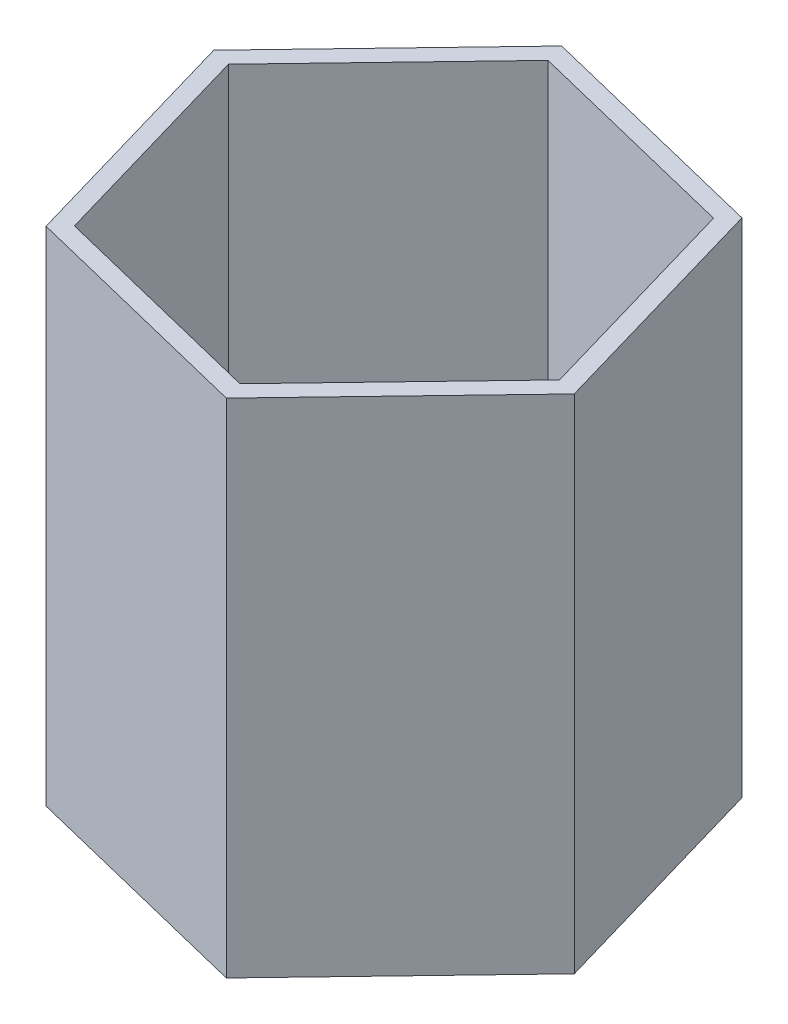
ISO-10303-21;
HEADER;
FILE_DESCRIPTION(('STEP AP214'),'2;1');
FILE_NAME('part.step','',(''),(''),'','','');
FILE_SCHEMA(('AUTOMOTIVE_DESIGN { 1 0 10303 214 1 1 1 1 }'));
ENDSEC;
DATA;
#1=APPLICATION_CONTEXT('core data for automotive mechanical design processes');
#2=APPLICATION_PROTOCOL_DEFINITION('international standard','automotive_design',2000,#1);
#3=PRODUCT_CONTEXT('',#1,'mechanical');
#4=PRODUCT('Part','Part','',(#3));
#5=PRODUCT_RELATED_PRODUCT_CATEGORY('part','',(#4));
#6=PRODUCT_DEFINITION_FORMATION('','',#4);
#7=PRODUCT_DEFINITION_CONTEXT('part definition',#1,'design');
#8=PRODUCT_DEFINITION('design','',#6,#7);
#9=PRODUCT_DEFINITION_SHAPE('','',#8);
#10=(LENGTH_UNIT() NAMED_UNIT(*) SI_UNIT(.MILLI.,.METRE.));
#11=(NAMED_UNIT(*) PLANE_ANGLE_UNIT() SI_UNIT($,.RADIAN.));
#12=(NAMED_UNIT(*) SI_UNIT($,.STERADIAN.) SOLID_ANGLE_UNIT());
#13=UNCERTAINTY_MEASURE_WITH_UNIT(LENGTH_MEASURE(1.E-05),#10,'distance_accuracy_value','');
#14=(GEOMETRIC_REPRESENTATION_CONTEXT(3) GLOBAL_UNCERTAINTY_ASSIGNED_CONTEXT((#13)) GLOBAL_UNIT_ASSIGNED_CONTEXT((#10,
#11,#12)) REPRESENTATION_CONTEXT('',''));
#15=CARTESIAN_POINT('',(0.,0.,0.));
#16=DIRECTION('',(0.,0.,1.));
#17=DIRECTION('',(1.,0.,0.));
#18=AXIS2_PLACEMENT_3D('',#15,#16,#17);
#19=CARTESIAN_POINT('',(0.,20.,0.));
#20=DIRECTION('',(0.,1.,0.));
#21=DIRECTION('',(0.,0.,1.));
#22=AXIS2_PLACEMENT_3D('',#19,#20,#21);
#23=PLANE('',#22);
#24=DIRECTION('',(-0.278917627653082,0.,-0.960315030073141));
#25=VECTOR('',#24,1.);
#26=CARTESIAN_POINT('',(9.5169370499578,20.,2.33835608647198));
#27=LINE('',#26,#25);
#28=CARTESIAN_POINT('',(9.5169370499578,20.,2.33835608647198));
#29=VERTEX_POINT('',#28);
#30=CARTESIAN_POINT('',(6.7835442989576,20.,-7.0727312082448));
#31=VERTEX_POINT('',#30);
#32=EDGE_CURVE('E198',#29,#31,#27,.T.);
#33=ORIENTED_EDGE('',*,*,#32,.T.);
#34=DIRECTION('',(-0.971116025505898,0.,-0.238607763925713));
#35=VECTOR('',#34,1.);
#36=CARTESIAN_POINT('',(6.7835442989576,20.,-7.0727312082448));
#37=LINE('',#36,#35);
#38=CARTESIAN_POINT('',(-2.7333927510002,20.,-9.41108729471678));
#39=VERTEX_POINT('',#38);
#40=EDGE_CURVE('E202',#31,#39,#37,.T.);
#41=ORIENTED_EDGE('',*,*,#40,.T.);
#42=DIRECTION('',(-0.692198397852816,0.,0.721707266147428));
#43=VECTOR('',#42,1.);
#44=CARTESIAN_POINT('',(-2.7333927510002,20.,-9.41108729471678));
#45=LINE('',#44,#43);
#46=CARTESIAN_POINT('',(-9.5169370499578,20.,-2.33835608647198));
#47=VERTEX_POINT('',#46);
#48=EDGE_CURVE('E206',#39,#47,#45,.T.);
#49=ORIENTED_EDGE('',*,*,#48,.T.);
#50=DIRECTION('',(0.278917627653081,0.,0.960315030073141));
#51=VECTOR('',#50,1.);
#52=CARTESIAN_POINT('',(-9.5169370499578,20.,-2.33835608647198));
#53=LINE('',#52,#51);
#54=CARTESIAN_POINT('',(-6.7835442989576,20.,7.07273120824479));
#55=VERTEX_POINT('',#54);
#56=EDGE_CURVE('E209',#47,#55,#53,.T.);
#57=ORIENTED_EDGE('',*,*,#56,.T.);
#58=DIRECTION('',(0.971116025505898,0.,0.238607763925713));
#59=VECTOR('',#58,1.);
#60=CARTESIAN_POINT('',(-6.7835442989576,20.,7.07273120824479));
#61=LINE('',#60,#59);
#62=CARTESIAN_POINT('',(2.7333927510002,20.,9.41108729471678));
#63=VERTEX_POINT('',#62);
#64=EDGE_CURVE('E212',#55,#63,#61,.T.);
#65=ORIENTED_EDGE('',*,*,#64,.T.);
#66=DIRECTION('',(0.692198397852816,0.,-0.721707266147428));
#67=VECTOR('',#66,1.);
#68=CARTESIAN_POINT('',(2.7333927510002,20.,9.41108729471678));
#69=LINE('',#68,#67);
#70=EDGE_CURVE('E215',#63,#29,#69,.T.);
#71=ORIENTED_EDGE('',*,*,#70,.T.);
#72=EDGE_LOOP('',(#33,#41,#49,#57,#65,#71));
#73=FACE_BOUND('',#72,.T.);
#74=DIRECTION('',(0.692198397852816,0.,-0.721707266147428));
#75=VECTOR('',#74,1.);
#76=CARTESIAN_POINT('',(2.51025864887773,20.,8.64283527065827));
#77=LINE('',#76,#75);
#78=CARTESIAN_POINT('',(2.51025864887773,20.,8.64283527065827));
#79=VERTEX_POINT('',#78);
#80=CARTESIAN_POINT('',(8.74004422955308,20.,2.14746987533141));
#81=VERTEX_POINT('',#80);
#82=EDGE_CURVE('E138',#79,#81,#77,.T.);
#83=ORIENTED_EDGE('',*,*,#82,.F.);
#84=DIRECTION('',(0.971116025505897,0.,0.238607763925713));
#85=VECTOR('',#84,1.);
#86=CARTESIAN_POINT('',(-6.22978558067535,20.,6.49536539532685));
#87=LINE('',#86,#85);
#88=CARTESIAN_POINT('',(-6.22978558067535,20.,6.49536539532685));
#89=VERTEX_POINT('',#88);
#90=EDGE_CURVE('E129',#89,#79,#87,.T.);
#91=ORIENTED_EDGE('',*,*,#90,.F.);
#92=DIRECTION('',(0.278917627653081,0.,0.960315030073141));
#93=VECTOR('',#92,1.);
#94=CARTESIAN_POINT('',(-8.74004422955308,20.,-2.14746987533142));
#95=LINE('',#94,#93);
#96=CARTESIAN_POINT('',(-8.74004422955308,20.,-2.14746987533142));
#97=VERTEX_POINT('',#96);
#98=EDGE_CURVE('E164',#97,#89,#95,.T.);
#99=ORIENTED_EDGE('',*,*,#98,.F.);
#100=DIRECTION('',(-0.692198397852816,0.,0.721707266147428));
#101=VECTOR('',#100,1.);
#102=CARTESIAN_POINT('',(-2.51025864887773,20.,-8.64283527065827));
#103=LINE('',#102,#101);
#104=CARTESIAN_POINT('',(-2.51025864887773,20.,-8.64283527065827));
#105=VERTEX_POINT('',#104);
#106=EDGE_CURVE('E161',#105,#97,#103,.T.);
#107=ORIENTED_EDGE('',*,*,#106,.F.);
#108=DIRECTION('',(-0.971116025505898,0.,-0.238607763925713));
#109=VECTOR('',#108,1.);
#110=CARTESIAN_POINT('',(6.22978558067535,20.,-6.49536539532685));
#111=LINE('',#110,#109);
#112=CARTESIAN_POINT('',(6.22978558067535,20.,-6.49536539532685));
#113=VERTEX_POINT('',#112);
#114=EDGE_CURVE('E156',#113,#105,#111,.T.);
#115=ORIENTED_EDGE('',*,*,#114,.F.);
#116=DIRECTION('',(-0.278917627653081,0.,-0.960315030073141));
#117=VECTOR('',#116,1.);
#118=CARTESIAN_POINT('',(8.74004422955308,20.,2.14746987533141));
#119=LINE('',#118,#117);
#120=EDGE_CURVE('E152',#81,#113,#119,.T.);
#121=ORIENTED_EDGE('',*,*,#120,.F.);
#122=EDGE_LOOP('',(#83,#91,#99,#107,#115,#121));
#123=FACE_BOUND('',#122,.T.);
#124=ADVANCED_FACE('F39',(#73,#123),#23,.T.);
#125=CARTESIAN_POINT('',(0.,0.,0.));
#126=DIRECTION('',(0.,1.,0.));
#127=DIRECTION('',(0.,0.,1.));
#128=AXIS2_PLACEMENT_3D('',#125,#126,#127);
#129=PLANE('',#128);
#130=DIRECTION('',(-0.278917627653082,0.,-0.960315030073141));
#131=VECTOR('',#130,1.);
#132=CARTESIAN_POINT('',(9.5169370499578,0.,2.33835608647198));
#133=LINE('',#132,#131);
#134=CARTESIAN_POINT('',(9.5169370499578,0.,2.33835608647198));
#135=VERTEX_POINT('',#134);
#136=CARTESIAN_POINT('',(6.7835442989576,0.,-7.0727312082448));
#137=VERTEX_POINT('',#136);
#138=EDGE_CURVE('E147',#135,#137,#133,.T.);
#139=ORIENTED_EDGE('',*,*,#138,.F.);
#140=DIRECTION('',(0.692198397852816,0.,-0.721707266147428));
#141=VECTOR('',#140,1.);
#142=CARTESIAN_POINT('',(2.7333927510002,0.,9.41108729471678));
#143=LINE('',#142,#141);
#144=CARTESIAN_POINT('',(2.7333927510002,0.,9.41108729471678));
#145=VERTEX_POINT('',#144);
#146=EDGE_CURVE('E203',#145,#135,#143,.T.);
#147=ORIENTED_EDGE('',*,*,#146,.F.);
#148=DIRECTION('',(0.971116025505898,0.,0.238607763925713));
#149=VECTOR('',#148,1.);
#150=CARTESIAN_POINT('',(-6.7835442989576,0.,7.07273120824479));
#151=LINE('',#150,#149);
#152=CARTESIAN_POINT('',(-6.7835442989576,0.,7.07273120824479));
#153=VERTEX_POINT('',#152);
#154=EDGE_CURVE('E231',#153,#145,#151,.T.);
#155=ORIENTED_EDGE('',*,*,#154,.F.);
#156=DIRECTION('',(0.278917627653081,0.,0.960315030073141));
#157=VECTOR('',#156,1.);
#158=CARTESIAN_POINT('',(-9.5169370499578,0.,-2.33835608647198));
#159=LINE('',#158,#157);
#160=CARTESIAN_POINT('',(-9.5169370499578,0.,-2.33835608647198));
#161=VERTEX_POINT('',#160);
#162=EDGE_CURVE('E228',#161,#153,#159,.T.);
#163=ORIENTED_EDGE('',*,*,#162,.F.);
#164=DIRECTION('',(-0.692198397852816,0.,0.721707266147428));
#165=VECTOR('',#164,1.);
#166=CARTESIAN_POINT('',(-2.7333927510002,0.,-9.41108729471678));
#167=LINE('',#166,#165);
#168=CARTESIAN_POINT('',(-2.7333927510002,0.,-9.41108729471678));
#169=VERTEX_POINT('',#168);
#170=EDGE_CURVE('E225',#169,#161,#167,.T.);
#171=ORIENTED_EDGE('',*,*,#170,.F.);
#172=DIRECTION('',(-0.971116025505898,0.,-0.238607763925713));
#173=VECTOR('',#172,1.);
#174=CARTESIAN_POINT('',(6.7835442989576,0.,-7.0727312082448));
#175=LINE('',#174,#173);
#176=EDGE_CURVE('E222',#137,#169,#175,.T.);
#177=ORIENTED_EDGE('',*,*,#176,.F.);
#178=EDGE_LOOP('',(#139,#147,#155,#163,#171,#177));
#179=FACE_BOUND('',#178,.T.);
#180=DIRECTION('',(0.971116025505897,0.,0.238607763925713));
#181=VECTOR('',#180,1.);
#182=CARTESIAN_POINT('',(-6.22978558067535,0.,6.49536539532685));
#183=LINE('',#182,#181);
#184=CARTESIAN_POINT('',(-6.22978558067535,0.,6.49536539532685));
#185=VERTEX_POINT('',#184);
#186=CARTESIAN_POINT('',(2.51025864887773,0.,8.64283527065827));
#187=VERTEX_POINT('',#186);
#188=EDGE_CURVE('E63',#185,#187,#183,.T.);
#189=ORIENTED_EDGE('',*,*,#188,.T.);
#190=DIRECTION('',(0.692198397852816,0.,-0.721707266147428));
#191=VECTOR('',#190,1.);
#192=CARTESIAN_POINT('',(2.51025864887773,0.,8.64283527065827));
#193=LINE('',#192,#191);
#194=CARTESIAN_POINT('',(8.74004422955308,0.,2.14746987533141));
#195=VERTEX_POINT('',#194);
#196=EDGE_CURVE('E145',#187,#195,#193,.T.);
#197=ORIENTED_EDGE('',*,*,#196,.T.);
#198=DIRECTION('',(-0.278917627653081,0.,-0.960315030073141));
#199=VECTOR('',#198,1.);
#200=CARTESIAN_POINT('',(8.74004422955308,0.,2.14746987533141));
#201=LINE('',#200,#199);
#202=CARTESIAN_POINT('',(6.22978558067535,0.,-6.49536539532685));
#203=VERTEX_POINT('',#202);
#204=EDGE_CURVE('E171',#195,#203,#201,.T.);
#205=ORIENTED_EDGE('',*,*,#204,.T.);
#206=DIRECTION('',(-0.971116025505898,0.,-0.238607763925713));
#207=VECTOR('',#206,1.);
#208=CARTESIAN_POINT('',(6.22978558067535,0.,-6.49536539532685));
#209=LINE('',#208,#207);
#210=CARTESIAN_POINT('',(-2.51025864887773,0.,-8.64283527065827));
#211=VERTEX_POINT('',#210);
#212=EDGE_CURVE('E175',#203,#211,#209,.T.);
#213=ORIENTED_EDGE('',*,*,#212,.T.);
#214=DIRECTION('',(-0.692198397852816,0.,0.721707266147428));
#215=VECTOR('',#214,1.);
#216=CARTESIAN_POINT('',(-2.51025864887773,0.,-8.64283527065827));
#217=LINE('',#216,#215);
#218=CARTESIAN_POINT('',(-8.74004422955308,0.,-2.14746987533142));
#219=VERTEX_POINT('',#218);
#220=EDGE_CURVE('E179',#211,#219,#217,.T.);
#221=ORIENTED_EDGE('',*,*,#220,.T.);
#222=DIRECTION('',(0.278917627653081,0.,0.960315030073141));
#223=VECTOR('',#222,1.);
#224=CARTESIAN_POINT('',(-8.74004422955308,0.,-2.14746987533142));
#225=LINE('',#224,#223);
#226=EDGE_CURVE('E139',#219,#185,#225,.T.);
#227=ORIENTED_EDGE('',*,*,#226,.T.);
#228=EDGE_LOOP('',(#189,#197,#205,#213,#221,#227));
#229=FACE_BOUND('',#228,.T.);
#230=ADVANCED_FACE('F262',(#179,#229),#129,.F.);
#231=CARTESIAN_POINT('',(9.5169370499578,20.,2.33835608647198));
#232=DIRECTION('',(-0.960315030073141,0.,0.278917627653082));
#233=DIRECTION('',(0.278917627653082,0.,0.960315030073141));
#234=AXIS2_PLACEMENT_3D('',#231,#232,#233);
#235=PLANE('',#234);
#236=ORIENTED_EDGE('',*,*,#138,.T.);
#237=DIRECTION('',(0.,-1.,0.));
#238=VECTOR('',#237,1.);
#239=CARTESIAN_POINT('',(6.7835442989576,20.,-7.0727312082448));
#240=LINE('',#239,#238);
#241=EDGE_CURVE('E11',#31,#137,#240,.T.);
#242=ORIENTED_EDGE('',*,*,#241,.F.);
#243=ORIENTED_EDGE('',*,*,#32,.F.);
#244=DIRECTION('',(0.,-1.,0.));
#245=VECTOR('',#244,1.);
#246=CARTESIAN_POINT('',(9.5169370499578,20.,2.33835608647198));
#247=LINE('',#246,#245);
#248=EDGE_CURVE('E218',#29,#135,#247,.T.);
#249=ORIENTED_EDGE('',*,*,#248,.T.);
#250=EDGE_LOOP('',(#236,#242,#243,#249));
#251=FACE_BOUND('',#250,.T.);
#252=ADVANCED_FACE('F41',(#251),#235,.F.);
#253=CARTESIAN_POINT('',(6.7835442989576,20.,-7.0727312082448));
#254=DIRECTION('',(-0.238607763925713,0.,0.971116025505898));
#255=DIRECTION('',(0.971116025505898,0.,0.238607763925713));
#256=AXIS2_PLACEMENT_3D('',#253,#254,#255);
#257=PLANE('',#256);
#258=ORIENTED_EDGE('',*,*,#176,.T.);
#259=DIRECTION('',(0.,-1.,0.));
#260=VECTOR('',#259,1.);
#261=CARTESIAN_POINT('',(-2.7333927510002,20.,-9.41108729471678));
#262=LINE('',#261,#260);
#263=EDGE_CURVE('E48',#39,#169,#262,.T.);
#264=ORIENTED_EDGE('',*,*,#263,.F.);
#265=ORIENTED_EDGE('',*,*,#40,.F.);
#266=ORIENTED_EDGE('',*,*,#241,.T.);
#267=EDGE_LOOP('',(#258,#264,#265,#266));
#268=FACE_BOUND('',#267,.T.);
#269=ADVANCED_FACE('F279',(#268),#257,.F.);
#270=CARTESIAN_POINT('',(-2.7333927510002,20.,-9.41108729471678));
#271=DIRECTION('',(0.721707266147428,0.,0.692198397852816));
#272=DIRECTION('',(0.692198397852816,0.,-0.721707266147428));
#273=AXIS2_PLACEMENT_3D('',#270,#271,#272);
#274=PLANE('',#273);
#275=ORIENTED_EDGE('',*,*,#170,.T.);
#276=DIRECTION('',(0.,-1.,0.));
#277=VECTOR('',#276,1.);
#278=CARTESIAN_POINT('',(-9.5169370499578,20.,-2.33835608647198));
#279=LINE('',#278,#277);
#280=EDGE_CURVE('E247',#47,#161,#279,.T.);
#281=ORIENTED_EDGE('',*,*,#280,.F.);
#282=ORIENTED_EDGE('',*,*,#48,.F.);
#283=ORIENTED_EDGE('',*,*,#263,.T.);
#284=EDGE_LOOP('',(#275,#281,#282,#283));
#285=FACE_BOUND('',#284,.T.);
#286=ADVANCED_FACE('F256',(#285),#274,.F.);
#287=CARTESIAN_POINT('',(-9.5169370499578,20.,-2.33835608647198));
#288=DIRECTION('',(0.960315030073141,0.,-0.278917627653081));
#289=DIRECTION('',(-0.278917627653081,0.,-0.960315030073141));
#290=AXIS2_PLACEMENT_3D('',#287,#288,#289);
#291=PLANE('',#290);
#292=ORIENTED_EDGE('',*,*,#162,.T.);
#293=DIRECTION('',(0.,-1.,0.));
#294=VECTOR('',#293,1.);
#295=CARTESIAN_POINT('',(-6.7835442989576,20.,7.07273120824479));
#296=LINE('',#295,#294);
#297=EDGE_CURVE('E243',#55,#153,#296,.T.);
#298=ORIENTED_EDGE('',*,*,#297,.F.);
#299=ORIENTED_EDGE('',*,*,#56,.F.);
#300=ORIENTED_EDGE('',*,*,#280,.T.);
#301=EDGE_LOOP('',(#292,#298,#299,#300));
#302=FACE_BOUND('',#301,.T.);
#303=ADVANCED_FACE('F268',(#302),#291,.F.);
#304=CARTESIAN_POINT('',(-6.7835442989576,20.,7.07273120824479));
#305=DIRECTION('',(0.238607763925713,0.,-0.971116025505897));
#306=DIRECTION('',(-0.971116025505898,0.,-0.238607763925713));
#307=AXIS2_PLACEMENT_3D('',#304,#305,#306);
#308=PLANE('',#307);
#309=ORIENTED_EDGE('',*,*,#154,.T.);
#310=DIRECTION('',(0.,-1.,0.));
#311=VECTOR('',#310,1.);
#312=CARTESIAN_POINT('',(2.7333927510002,20.,9.41108729471678));
#313=LINE('',#312,#311);
#314=EDGE_CURVE('E239',#63,#145,#313,.T.);
#315=ORIENTED_EDGE('',*,*,#314,.F.);
#316=ORIENTED_EDGE('',*,*,#64,.F.);
#317=ORIENTED_EDGE('',*,*,#297,.T.);
#318=EDGE_LOOP('',(#309,#315,#316,#317));
#319=FACE_BOUND('',#318,.T.);
#320=ADVANCED_FACE('F272',(#319),#308,.F.);
#321=CARTESIAN_POINT('',(2.7333927510002,20.,9.41108729471678));
#322=DIRECTION('',(-0.721707266147428,0.,-0.692198397852816));
#323=DIRECTION('',(-0.692198397852816,0.,0.721707266147428));
#324=AXIS2_PLACEMENT_3D('',#321,#322,#323);
#325=PLANE('',#324);
#326=ORIENTED_EDGE('',*,*,#146,.T.);
#327=ORIENTED_EDGE('',*,*,#248,.F.);
#328=ORIENTED_EDGE('',*,*,#70,.F.);
#329=ORIENTED_EDGE('',*,*,#314,.T.);
#330=EDGE_LOOP('',(#326,#327,#328,#329));
#331=FACE_BOUND('',#330,.T.);
#332=ADVANCED_FACE('F282',(#331),#325,.F.);
#333=CARTESIAN_POINT('',(-6.22978558067535,20.,6.49536539532685));
#334=DIRECTION('',(0.238607763925713,0.,-0.971116025505898));
#335=DIRECTION('',(-0.971116025505898,0.,-0.238607763925713));
#336=AXIS2_PLACEMENT_3D('',#333,#334,#335);
#337=PLANE('',#336);
#338=ORIENTED_EDGE('',*,*,#188,.F.);
#339=DIRECTION('',(0.,-1.,0.));
#340=VECTOR('',#339,1.);
#341=CARTESIAN_POINT('',(-6.22978558067535,20.,6.49536539532685));
#342=LINE('',#341,#340);
#343=EDGE_CURVE('E133',#89,#185,#342,.T.);
#344=ORIENTED_EDGE('',*,*,#343,.F.);
#345=ORIENTED_EDGE('',*,*,#90,.T.);
#346=DIRECTION('',(0.,-1.,0.));
#347=VECTOR('',#346,1.);
#348=CARTESIAN_POINT('',(2.51025864887773,20.,8.64283527065827));
#349=LINE('',#348,#347);
#350=EDGE_CURVE('E132',#79,#187,#349,.T.);
#351=ORIENTED_EDGE('',*,*,#350,.T.);
#352=EDGE_LOOP('',(#338,#344,#345,#351));
#353=FACE_BOUND('',#352,.T.);
#354=ADVANCED_FACE('F131',(#353),#337,.T.);
#355=CARTESIAN_POINT('',(2.51025864887773,20.,8.64283527065827));
#356=DIRECTION('',(-0.721707266147428,0.,-0.692198397852816));
#357=DIRECTION('',(-0.692198397852816,0.,0.721707266147428));
#358=AXIS2_PLACEMENT_3D('',#355,#356,#357);
#359=PLANE('',#358);
#360=ORIENTED_EDGE('',*,*,#196,.F.);
#361=ORIENTED_EDGE('',*,*,#350,.F.);
#362=ORIENTED_EDGE('',*,*,#82,.T.);
#363=DIRECTION('',(0.,-1.,0.));
#364=VECTOR('',#363,1.);
#365=CARTESIAN_POINT('',(8.74004422955308,20.,2.14746987533141));
#366=LINE('',#365,#364);
#367=EDGE_CURVE('E148',#81,#195,#366,.T.);
#368=ORIENTED_EDGE('',*,*,#367,.T.);
#369=EDGE_LOOP('',(#360,#361,#362,#368));
#370=FACE_BOUND('',#369,.T.);
#371=ADVANCED_FACE('F142',(#370),#359,.T.);
#372=CARTESIAN_POINT('',(8.74004422955308,20.,2.14746987533141));
#373=DIRECTION('',(-0.960315030073141,0.,0.278917627653081));
#374=DIRECTION('',(0.278917627653081,0.,0.960315030073141));
#375=AXIS2_PLACEMENT_3D('',#372,#373,#374);
#376=PLANE('',#375);
#377=ORIENTED_EDGE('',*,*,#204,.F.);
#378=ORIENTED_EDGE('',*,*,#367,.F.);
#379=ORIENTED_EDGE('',*,*,#120,.T.);
#380=DIRECTION('',(0.,-1.,0.));
#381=VECTOR('',#380,1.);
#382=CARTESIAN_POINT('',(6.22978558067535,20.,-6.49536539532685));
#383=LINE('',#382,#381);
#384=EDGE_CURVE('E193',#113,#203,#383,.T.);
#385=ORIENTED_EDGE('',*,*,#384,.T.);
#386=EDGE_LOOP('',(#377,#378,#379,#385));
#387=FACE_BOUND('',#386,.T.);
#388=ADVANCED_FACE('F300',(#387),#376,.T.);
#389=CARTESIAN_POINT('',(6.22978558067535,20.,-6.49536539532685));
#390=DIRECTION('',(-0.238607763925713,0.,0.971116025505898));
#391=DIRECTION('',(0.971116025505898,0.,0.238607763925713));
#392=AXIS2_PLACEMENT_3D('',#389,#390,#391);
#393=PLANE('',#392);
#394=ORIENTED_EDGE('',*,*,#212,.F.);
#395=ORIENTED_EDGE('',*,*,#384,.F.);
#396=ORIENTED_EDGE('',*,*,#114,.T.);
#397=DIRECTION('',(0.,-1.,0.));
#398=VECTOR('',#397,1.);
#399=CARTESIAN_POINT('',(-2.51025864887773,20.,-8.64283527065827));
#400=LINE('',#399,#398);
#401=EDGE_CURVE('E190',#105,#211,#400,.T.);
#402=ORIENTED_EDGE('',*,*,#401,.T.);
#403=EDGE_LOOP('',(#394,#395,#396,#402));
#404=FACE_BOUND('',#403,.T.);
#405=ADVANCED_FACE('F303',(#404),#393,.T.);
#406=CARTESIAN_POINT('',(-2.51025864887773,20.,-8.64283527065827));
#407=DIRECTION('',(0.721707266147428,0.,0.692198397852816));
#408=DIRECTION('',(0.692198397852816,0.,-0.721707266147428));
#409=AXIS2_PLACEMENT_3D('',#406,#407,#408);
#410=PLANE('',#409);
#411=ORIENTED_EDGE('',*,*,#220,.F.);
#412=ORIENTED_EDGE('',*,*,#401,.F.);
#413=ORIENTED_EDGE('',*,*,#106,.T.);
#414=DIRECTION('',(0.,-1.,0.));
#415=VECTOR('',#414,1.);
#416=CARTESIAN_POINT('',(-8.74004422955308,20.,-2.14746987533142));
#417=LINE('',#416,#415);
#418=EDGE_CURVE('E55',#97,#219,#417,.T.);
#419=ORIENTED_EDGE('',*,*,#418,.T.);
#420=EDGE_LOOP('',(#411,#412,#413,#419));
#421=FACE_BOUND('',#420,.T.);
#422=ADVANCED_FACE('F307',(#421),#410,.T.);
#423=CARTESIAN_POINT('',(-8.74004422955308,20.,-2.14746987533142));
#424=DIRECTION('',(0.960315030073141,0.,-0.278917627653081));
#425=DIRECTION('',(-0.278917627653081,0.,-0.960315030073141));
#426=AXIS2_PLACEMENT_3D('',#423,#424,#425);
#427=PLANE('',#426);
#428=ORIENTED_EDGE('',*,*,#226,.F.);
#429=ORIENTED_EDGE('',*,*,#418,.F.);
#430=ORIENTED_EDGE('',*,*,#98,.T.);
#431=ORIENTED_EDGE('',*,*,#343,.T.);
#432=EDGE_LOOP('',(#428,#429,#430,#431));
#433=FACE_BOUND('',#432,.T.);
#434=ADVANCED_FACE('F311',(#433),#427,.T.);
#435=CLOSED_SHELL('',(#124,#230,#252,#269,#286,#303,#320,#332,#354,#371,#388,#405,#422,#434));
#436=MANIFOLD_SOLID_BREP('B2',#435);
#437=ADVANCED_BREP_SHAPE_REPRESENTATION('',(#18,#436),#14);
#438=SHAPE_DEFINITION_REPRESENTATION(#9,#437);
ENDSEC;
END-ISO-10303-21;
